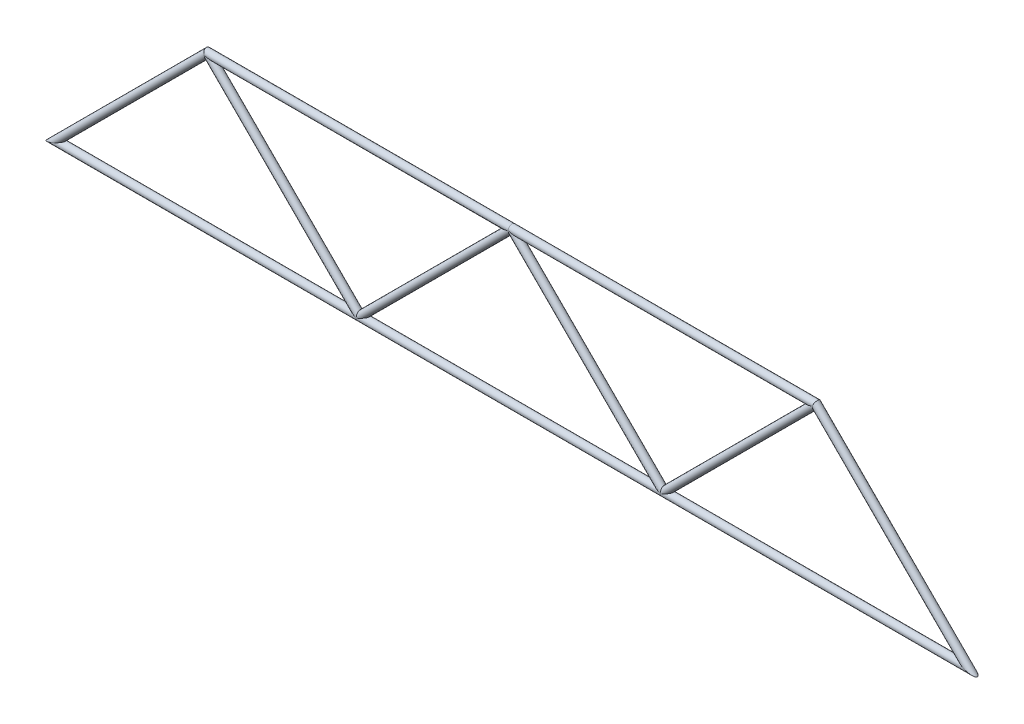
ISO-10303-21;
HEADER;
FILE_DESCRIPTION(('STEP AP214'),'2;1');
FILE_NAME('part.step','',(''),(''),'','','');
FILE_SCHEMA(('AUTOMOTIVE_DESIGN { 1 0 10303 214 1 1 1 1 }'));
ENDSEC;
DATA;
#1=APPLICATION_CONTEXT('core data for automotive mechanical design processes');
#2=APPLICATION_PROTOCOL_DEFINITION('international standard','automotive_design',2000,#1);
#3=PRODUCT_CONTEXT('',#1,'mechanical');
#4=PRODUCT('Part','Part','',(#3));
#5=PRODUCT_RELATED_PRODUCT_CATEGORY('part','',(#4));
#6=PRODUCT_DEFINITION_FORMATION('','',#4);
#7=PRODUCT_DEFINITION_CONTEXT('part definition',#1,'design');
#8=PRODUCT_DEFINITION('design','',#6,#7);
#9=PRODUCT_DEFINITION_SHAPE('','',#8);
#10=(LENGTH_UNIT() NAMED_UNIT(*) SI_UNIT(.MILLI.,.METRE.));
#11=(NAMED_UNIT(*) PLANE_ANGLE_UNIT() SI_UNIT($,.RADIAN.));
#12=(NAMED_UNIT(*) SI_UNIT($,.STERADIAN.) SOLID_ANGLE_UNIT());
#13=UNCERTAINTY_MEASURE_WITH_UNIT(LENGTH_MEASURE(1.E-05),#10,'distance_accuracy_value','');
#14=(GEOMETRIC_REPRESENTATION_CONTEXT(3) GLOBAL_UNCERTAINTY_ASSIGNED_CONTEXT((#13)) GLOBAL_UNIT_ASSIGNED_CONTEXT((#10,
#11,#12)) REPRESENTATION_CONTEXT('',''));
#15=CARTESIAN_POINT('',(0.,0.,0.));
#16=DIRECTION('',(0.,0.,1.));
#17=DIRECTION('',(1.,0.,0.));
#18=AXIS2_PLACEMENT_3D('',#15,#16,#17);
#19=CARTESIAN_POINT('',(999.999999999996,1000.,0.));
#20=DIRECTION('',(-0.707106781186546,-0.707106781186549,0.));
#21=DIRECTION('',(0.707106781186549,-0.707106781186546,0.));
#22=AXIS2_PLACEMENT_3D('',#19,#20,#21);
#23=CYLINDRICAL_SURFACE('',#22,25.);
#24=CARTESIAN_POINT('',(999.999999999996,1000.,0.));
#25=DIRECTION('',(0.923879532511286,0.38268343236509,0.));
#26=DIRECTION('',(0.382683432365091,-0.923879532511286,0.));
#27=AXIS2_PLACEMENT_3D('',#24,#25,#26);
#28=ELLIPSE('',#27,27.0598050073099,25.);
#29=CARTESIAN_POINT('',(1010.35533905932,975.,0.));
#30=VERTEX_POINT('',#29);
#31=EDGE_CURVE('E66',#30,#30,#28,.T.);
#32=ORIENTED_EDGE('',*,*,#31,.F.);
#33=EDGE_LOOP('',(#32));
#34=FACE_BOUND('',#33,.T.);
#35=CARTESIAN_POINT('',(1.66533453693773E-13,1.66533453693773E-13,0.));
#36=DIRECTION('',(0.382683432365091,-0.923879532511286,0.));
#37=DIRECTION('',(-0.923879532511286,-0.382683432365091,0.));
#38=AXIS2_PLACEMENT_3D('',#35,#36,#37);
#39=ELLIPSE('',#38,65.3281482438187,25.);
#40=CARTESIAN_POINT('',(-60.3553390593271,-24.9999999999999,0.));
#41=VERTEX_POINT('',#40);
#42=EDGE_CURVE('E12',#41,#41,#39,.T.);
#43=ORIENTED_EDGE('',*,*,#42,.F.);
#44=EDGE_LOOP('',(#43));
#45=FACE_BOUND('',#44,.T.);
#46=ADVANCED_FACE('F59',(#34,#45),#23,.T.);
#47=CARTESIAN_POINT('',(999.999999999996,1000.,0.));
#48=DIRECTION('',(0.923879532511286,0.38268343236509,0.));
#49=DIRECTION('',(-0.382683432365091,0.923879532511286,0.));
#50=AXIS2_PLACEMENT_3D('',#47,#48,#49);
#51=PLANE('',#50);
#52=ORIENTED_EDGE('',*,*,#31,.T.);
#53=EDGE_LOOP('',(#52));
#54=FACE_BOUND('',#53,.T.);
#55=ADVANCED_FACE('F72',(#54),#51,.T.);
#56=CARTESIAN_POINT('',(1.66533453693773E-13,1.66533453693773E-13,0.));
#57=DIRECTION('',(0.382683432365091,-0.923879532511286,0.));
#58=DIRECTION('',(0.923879532511286,0.382683432365091,0.));
#59=AXIS2_PLACEMENT_3D('',#56,#57,#58);
#60=PLANE('',#59);
#61=ORIENTED_EDGE('',*,*,#42,.T.);
#62=EDGE_LOOP('',(#61));
#63=FACE_BOUND('',#62,.T.);
#64=ADVANCED_FACE('F61',(#63),#60,.T.);
#65=CLOSED_SHELL('',(#46,#55,#64));
#66=MANIFOLD_SOLID_BREP('B2',#65);
#67=CARTESIAN_POINT('',(-9.99200722162641E-13,1.77635683940025E-12,0.));
#68=DIRECTION('',(1.,0.,0.));
#69=DIRECTION('',(0.,0.,-1.));
#70=AXIS2_PLACEMENT_3D('',#67,#68,#69);
#71=CYLINDRICAL_SURFACE('',#70,25.);
#72=CARTESIAN_POINT('',(2000.,1.77643815456319E-12,0.));
#73=DIRECTION('',(1.,0.,0.));
#74=DIRECTION('',(0.,1.,0.));
#75=AXIS2_PLACEMENT_3D('',#72,#73,#74);
#76=CIRCLE('',#75,25.);
#77=CARTESIAN_POINT('',(2000.,25.0000000000018,0.));
#78=VERTEX_POINT('',#77);
#79=EDGE_CURVE('E150',#78,#78,#76,.T.);
#80=ORIENTED_EDGE('',*,*,#79,.F.);
#81=EDGE_LOOP('',(#80));
#82=FACE_BOUND('',#81,.T.);
#83=CARTESIAN_POINT('',(4.21884749357559E-12,1.776248419183E-12,0.));
#84=DIRECTION('',(-0.382683432365091,0.923879532511287,0.));
#85=DIRECTION('',(0.923879532511286,0.382683432365091,0.));
#86=AXIS2_PLACEMENT_3D('',#83,#84,#85);
#87=ELLIPSE('',#86,65.3281482438187,25.);
#88=CARTESIAN_POINT('',(60.3553390593314,25.0000000000018,0.));
#89=VERTEX_POINT('',#88);
#90=EDGE_CURVE('E58',#89,#89,#87,.T.);
#91=ORIENTED_EDGE('',*,*,#90,.F.);
#92=EDGE_LOOP('',(#91));
#93=FACE_BOUND('',#92,.T.);
#94=ADVANCED_FACE('F143',(#82,#93),#71,.T.);
#95=CARTESIAN_POINT('',(2000.,0.,0.));
#96=DIRECTION('',(1.,0.,0.));
#97=DIRECTION('',(0.,1.,0.));
#98=AXIS2_PLACEMENT_3D('',#95,#96,#97);
#99=PLANE('',#98);
#100=ORIENTED_EDGE('',*,*,#79,.T.);
#101=EDGE_LOOP('',(#100));
#102=FACE_BOUND('',#101,.T.);
#103=ADVANCED_FACE('F156',(#102),#99,.T.);
#104=CARTESIAN_POINT('',(-1.11022302462516E-13,0.,0.));
#105=DIRECTION('',(-0.382683432365091,0.923879532511287,0.));
#106=DIRECTION('',(-0.923879532511286,-0.382683432365091,0.));
#107=AXIS2_PLACEMENT_3D('',#104,#105,#106);
#108=PLANE('',#107);
#109=ORIENTED_EDGE('',*,*,#90,.T.);
#110=EDGE_LOOP('',(#109));
#111=FACE_BOUND('',#110,.T.);
#112=ADVANCED_FACE('F145',(#111),#108,.T.);
#113=CLOSED_SHELL('',(#94,#103,#112));
#114=MANIFOLD_SOLID_BREP('B7',#113);
#115=CARTESIAN_POINT('',(2000.,-1.66533453693773E-13,0.));
#116=DIRECTION('',(-0.707106781186549,0.707106781186546,0.));
#117=DIRECTION('',(-0.707106781186546,-0.707106781186549,0.));
#118=AXIS2_PLACEMENT_3D('',#115,#116,#117);
#119=CYLINDRICAL_SURFACE('',#118,25.);
#120=CARTESIAN_POINT('',(2000.,1.72084568816899E-12,0.));
#121=DIRECTION('',(0.382683432365089,0.923879532511287,0.));
#122=DIRECTION('',(-0.923879532511287,0.382683432365089,0.));
#123=AXIS2_PLACEMENT_3D('',#120,#121,#122);
#124=ELLIPSE('',#123,65.328148243819,25.);
#125=CARTESIAN_POINT('',(2000.,3.38618022510673E-12,25.));
#126=VERTEX_POINT('',#125);
#127=CARTESIAN_POINT('',(2000.,3.38618022510673E-12,-25.));
#128=VERTEX_POINT('',#127);
#129=EDGE_CURVE('E250',#126,#128,#124,.F.);
#130=ORIENTED_EDGE('',*,*,#129,.F.);
#131=CARTESIAN_POINT('',(2000.,-1.66533453693773E-13,0.));
#132=DIRECTION('',(1.,0.,0.));
#133=DIRECTION('',(0.,1.,0.));
#134=AXIS2_PLACEMENT_3D('',#131,#132,#133);
#135=ELLIPSE('',#134,35.3553390593274,25.);
#136=EDGE_CURVE('E258',#128,#126,#135,.T.);
#137=ORIENTED_EDGE('',*,*,#136,.F.);
#138=EDGE_LOOP('',(#130,#137));
#139=FACE_BOUND('',#138,.T.);
#140=CARTESIAN_POINT('',(999.999999999997,1000.,0.));
#141=DIRECTION('',(0.382683432365089,0.923879532511287,0.));
#142=DIRECTION('',(-0.923879532511287,0.382683432365089,0.));
#143=AXIS2_PLACEMENT_3D('',#140,#141,#142);
#144=ELLIPSE('',#143,65.328148243819,25.);
#145=CARTESIAN_POINT('',(999.999999999996,1000.,25.));
#146=VERTEX_POINT('',#145);
#147=CARTESIAN_POINT('',(999.999999999996,1000.,-25.));
#148=VERTEX_POINT('',#147);
#149=EDGE_CURVE('E255',#146,#148,#144,.T.);
#150=ORIENTED_EDGE('',*,*,#149,.F.);
#151=CARTESIAN_POINT('',(999.999999999996,1000.,0.));
#152=DIRECTION('',(-1.,0.,0.));
#153=DIRECTION('',(0.,1.,0.));
#154=AXIS2_PLACEMENT_3D('',#151,#152,#153);
#155=ELLIPSE('',#154,35.3553390593274,25.);
#156=EDGE_CURVE('E141',#148,#146,#155,.T.);
#157=ORIENTED_EDGE('',*,*,#156,.F.);
#158=EDGE_LOOP('',(#150,#157));
#159=FACE_BOUND('',#158,.T.);
#160=ADVANCED_FACE('F225',(#139,#159),#119,.T.);
#161=CARTESIAN_POINT('',(2000.,-1.66533453693773E-13,0.));
#162=DIRECTION('',(1.,0.,0.));
#163=DIRECTION('',(0.,1.,0.));
#164=AXIS2_PLACEMENT_3D('',#161,#162,#163);
#165=PLANE('',#164);
#166=ORIENTED_EDGE('',*,*,#136,.T.);
#167=CARTESIAN_POINT('',(2000.,1.66533453693773E-12,0.));
#168=DIRECTION('',(1.,0.,0.));
#169=DIRECTION('',(0.,1.,0.));
#170=AXIS2_PLACEMENT_3D('',#167,#168,#169);
#171=CIRCLE('',#170,25.);
#172=EDGE_CURVE('E248',#126,#128,#171,.F.);
#173=ORIENTED_EDGE('',*,*,#172,.T.);
#174=EDGE_LOOP('',(#166,#173));
#175=FACE_BOUND('',#174,.T.);
#176=ADVANCED_FACE('F257',(#175),#165,.T.);
#177=CARTESIAN_POINT('',(-1.33226762955019E-12,1.99840144432528E-12,0.));
#178=DIRECTION('',(1.,0.,0.));
#179=DIRECTION('',(0.,0.,-1.));
#180=AXIS2_PLACEMENT_3D('',#177,#178,#179);
#181=CYLINDRICAL_SURFACE('',#180,25.);
#182=ORIENTED_EDGE('',*,*,#129,.T.);
#183=ORIENTED_EDGE('',*,*,#172,.F.);
#184=EDGE_LOOP('',(#182,#183));
#185=FACE_BOUND('',#184,.T.);
#186=ADVANCED_FACE('F251',(#185),#181,.F.);
#187=CARTESIAN_POINT('',(3000.,1000.,0.));
#188=DIRECTION('',(-1.,0.,0.));
#189=DIRECTION('',(0.,-1.,0.));
#190=AXIS2_PLACEMENT_3D('',#187,#188,#189);
#191=CYLINDRICAL_SURFACE('',#190,25.);
#192=ORIENTED_EDGE('',*,*,#149,.T.);
#193=CARTESIAN_POINT('',(999.999999999996,1000.,0.));
#194=DIRECTION('',(-0.923879532511286,-0.382683432365091,0.));
#195=DIRECTION('',(-0.382683432365091,0.923879532511287,0.));
#196=AXIS2_PLACEMENT_3D('',#193,#194,#195);
#197=ELLIPSE('',#196,27.0598050073099,25.);
#198=EDGE_CURVE('E229',#148,#146,#197,.T.);
#199=ORIENTED_EDGE('',*,*,#198,.T.);
#200=EDGE_LOOP('',(#192,#199));
#201=FACE_BOUND('',#200,.T.);
#202=ADVANCED_FACE('F227',(#201),#191,.F.);
#203=CARTESIAN_POINT('',(999.999999999996,1000.,0.));
#204=DIRECTION('',(-0.707106781186546,-0.707106781186549,0.));
#205=DIRECTION('',(0.707106781186549,-0.707106781186546,0.));
#206=AXIS2_PLACEMENT_3D('',#203,#204,#205);
#207=CYLINDRICAL_SURFACE('',#206,25.);
#208=ORIENTED_EDGE('',*,*,#156,.T.);
#209=ORIENTED_EDGE('',*,*,#198,.F.);
#210=EDGE_LOOP('',(#208,#209));
#211=FACE_BOUND('',#210,.T.);
#212=ADVANCED_FACE('F266',(#211),#207,.F.);
#213=CLOSED_SHELL('',(#160,#176,#186,#202,#212));
#214=MANIFOLD_SOLID_BREP('B53',#213);
#215=CARTESIAN_POINT('',(3000.,1000.00000000001,-9.87544571080938E-12));
#216=DIRECTION('',(-1.,0.,0.));
#217=DIRECTION('',(0.,-1.,0.));
#218=AXIS2_PLACEMENT_3D('',#215,#216,#217);
#219=CYLINDRICAL_SURFACE('',#218,25.);
#220=CARTESIAN_POINT('',(3000.,1000.00000000001,-9.87544571080938E-12));
#221=DIRECTION('',(1.,0.,0.));
#222=DIRECTION('',(0.,1.,0.));
#223=AXIS2_PLACEMENT_3D('',#220,#221,#222);
#224=CIRCLE('',#223,25.);
#225=CARTESIAN_POINT('',(3000.,1025.00000000001,-9.87822126837094E-12));
#226=VERTEX_POINT('',#225);
#227=EDGE_CURVE('E370',#226,#226,#224,.T.);
#228=ORIENTED_EDGE('',*,*,#227,.F.);
#229=EDGE_LOOP('',(#228));
#230=FACE_BOUND('',#229,.T.);
#231=CARTESIAN_POINT('',(999.999999999996,999.99999999999,9.87540427898686E-12));
#232=DIRECTION('',(-0.923879532511283,-0.3826834323651,0.));
#233=DIRECTION('',(-0.3826834323651,0.923879532511283,0.));
#234=AXIS2_PLACEMENT_3D('',#231,#232,#233);
#235=ELLIPSE('',#234,27.0598050073099,25.);
#236=CARTESIAN_POINT('',(989.644660940668,1024.99999999999,9.97604638116615E-12));
#237=VERTEX_POINT('',#236);
#238=EDGE_CURVE('E224',#237,#237,#235,.T.);
#239=ORIENTED_EDGE('',*,*,#238,.F.);
#240=EDGE_LOOP('',(#239));
#241=FACE_BOUND('',#240,.T.);
#242=ADVANCED_FACE('F363',(#230,#241),#219,.T.);
#243=CARTESIAN_POINT('',(3000.,1000.00000000001,-9.87544571080938E-12));
#244=DIRECTION('',(1.,0.,0.));
#245=DIRECTION('',(0.,1.,0.));
#246=AXIS2_PLACEMENT_3D('',#243,#244,#245);
#247=PLANE('',#246);
#248=ORIENTED_EDGE('',*,*,#227,.T.);
#249=EDGE_LOOP('',(#248));
#250=FACE_BOUND('',#249,.T.);
#251=ADVANCED_FACE('F376',(#250),#247,.T.);
#252=CARTESIAN_POINT('',(999.999999999996,999.99999999999,9.87540427898686E-12));
#253=DIRECTION('',(-0.923879532511283,-0.3826834323651,0.));
#254=DIRECTION('',(0.3826834323651,-0.923879532511283,0.));
#255=AXIS2_PLACEMENT_3D('',#252,#253,#254);
#256=PLANE('',#255);
#257=ORIENTED_EDGE('',*,*,#238,.T.);
#258=EDGE_LOOP('',(#257));
#259=FACE_BOUND('',#258,.T.);
#260=ADVANCED_FACE('F365',(#259),#256,.T.);
#261=CLOSED_SHELL('',(#242,#251,#260));
#262=MANIFOLD_SOLID_BREP('B135',#261);
#263=CARTESIAN_POINT('',(3000.,1000.,0.));
#264=DIRECTION('',(-0.707106781186546,-0.707106781186549,0.));
#265=DIRECTION('',(0.707106781186549,-0.707106781186546,0.));
#266=AXIS2_PLACEMENT_3D('',#263,#264,#265);
#267=CYLINDRICAL_SURFACE('',#266,25.);
#268=CARTESIAN_POINT('',(2000.,1.83186799063151E-12,0.));
#269=DIRECTION('',(0.382683432365091,-0.923879532511286,0.));
#270=DIRECTION('',(-0.923879532511286,-0.382683432365091,0.));
#271=AXIS2_PLACEMENT_3D('',#268,#269,#270);
#272=ELLIPSE('',#271,65.3281482438187,25.);
#273=CARTESIAN_POINT('',(2000.,3.38618022510673E-12,-25.));
#274=VERTEX_POINT('',#273);
#275=CARTESIAN_POINT('',(2000.,3.44169137633799E-12,25.));
#276=VERTEX_POINT('',#275);
#277=EDGE_CURVE('E457',#274,#276,#272,.T.);
#278=ORIENTED_EDGE('',*,*,#277,.F.);
#279=CARTESIAN_POINT('',(2000.,3.33066907387547E-13,0.));
#280=DIRECTION('',(-1.,0.,0.));
#281=DIRECTION('',(0.,-1.,0.));
#282=AXIS2_PLACEMENT_3D('',#279,#280,#281);
#283=ELLIPSE('',#282,35.3553390593274,25.);
#284=EDGE_CURVE('E479',#276,#274,#283,.T.);
#285=ORIENTED_EDGE('',*,*,#284,.F.);
#286=EDGE_LOOP('',(#278,#285));
#287=FACE_BOUND('',#286,.T.);
#288=CARTESIAN_POINT('',(3000.,1000.,0.));
#289=DIRECTION('',(0.382683432365091,-0.923879532511286,0.));
#290=DIRECTION('',(-0.923879532511286,-0.38268343236509,0.));
#291=AXIS2_PLACEMENT_3D('',#288,#289,#290);
#292=ELLIPSE('',#291,65.3281482438187,25.);
#293=CARTESIAN_POINT('',(3000.,1000.,-25.));
#294=VERTEX_POINT('',#293);
#295=CARTESIAN_POINT('',(3000.,1000.,25.));
#296=VERTEX_POINT('',#295);
#297=EDGE_CURVE('E361',#294,#296,#292,.F.);
#298=ORIENTED_EDGE('',*,*,#297,.F.);
#299=CARTESIAN_POINT('',(3000.,1000.,0.));
#300=DIRECTION('',(1.,0.,0.));
#301=DIRECTION('',(0.,-1.,0.));
#302=AXIS2_PLACEMENT_3D('',#299,#300,#301);
#303=ELLIPSE('',#302,35.3553390593274,25.);
#304=EDGE_CURVE('E451',#296,#294,#303,.T.);
#305=ORIENTED_EDGE('',*,*,#304,.F.);
#306=EDGE_LOOP('',(#298,#305));
#307=FACE_BOUND('',#306,.T.);
#308=ADVANCED_FACE('F447',(#287,#307),#267,.T.);
#309=CARTESIAN_POINT('',(3000.,1000.,0.));
#310=DIRECTION('',(1.,0.,0.));
#311=DIRECTION('',(0.,1.,0.));
#312=AXIS2_PLACEMENT_3D('',#309,#310,#311);
#313=PLANE('',#312);
#314=ORIENTED_EDGE('',*,*,#304,.T.);
#315=CARTESIAN_POINT('',(3000.,1000.,0.));
#316=DIRECTION('',(1.,0.,0.));
#317=DIRECTION('',(0.,1.,0.));
#318=AXIS2_PLACEMENT_3D('',#315,#316,#317);
#319=CIRCLE('',#318,25.);
#320=EDGE_CURVE('E464',#294,#296,#319,.F.);
#321=ORIENTED_EDGE('',*,*,#320,.T.);
#322=EDGE_LOOP('',(#314,#321));
#323=FACE_BOUND('',#322,.T.);
#324=ADVANCED_FACE('F488',(#323),#313,.T.);
#325=CARTESIAN_POINT('',(2000.,1.11022302462516E-13,0.));
#326=DIRECTION('',(-1.,0.,0.));
#327=DIRECTION('',(0.,-1.,0.));
#328=AXIS2_PLACEMENT_3D('',#325,#326,#327);
#329=PLANE('',#328);
#330=ORIENTED_EDGE('',*,*,#284,.T.);
#331=CARTESIAN_POINT('',(2000.,1.83186799063151E-12,0.));
#332=DIRECTION('',(-1.,0.,0.));
#333=DIRECTION('',(0.,-1.,0.));
#334=AXIS2_PLACEMENT_3D('',#331,#332,#333);
#335=CIRCLE('',#334,25.);
#336=EDGE_CURVE('E472',#274,#276,#335,.F.);
#337=ORIENTED_EDGE('',*,*,#336,.T.);
#338=EDGE_LOOP('',(#330,#337));
#339=FACE_BOUND('',#338,.T.);
#340=ADVANCED_FACE('F483',(#339),#329,.T.);
#341=CARTESIAN_POINT('',(-8.88178419700125E-13,2.22044604925031E-12,0.));
#342=DIRECTION('',(1.,0.,0.));
#343=DIRECTION('',(0.,0.,-1.));
#344=AXIS2_PLACEMENT_3D('',#341,#342,#343);
#345=CYLINDRICAL_SURFACE('',#344,25.);
#346=ORIENTED_EDGE('',*,*,#277,.T.);
#347=ORIENTED_EDGE('',*,*,#336,.F.);
#348=EDGE_LOOP('',(#346,#347));
#349=FACE_BOUND('',#348,.T.);
#350=ADVANCED_FACE('F476',(#349),#345,.F.);
#351=CARTESIAN_POINT('',(5000.,1000.,0.));
#352=DIRECTION('',(-1.,0.,0.));
#353=DIRECTION('',(0.,-1.,0.));
#354=AXIS2_PLACEMENT_3D('',#351,#352,#353);
#355=CYLINDRICAL_SURFACE('',#354,25.);
#356=ORIENTED_EDGE('',*,*,#297,.T.);
#357=ORIENTED_EDGE('',*,*,#320,.F.);
#358=EDGE_LOOP('',(#356,#357));
#359=FACE_BOUND('',#358,.T.);
#360=ADVANCED_FACE('F449',(#359),#355,.F.);
#361=CLOSED_SHELL('',(#308,#324,#340,#350,#360));
#362=MANIFOLD_SOLID_BREP('B219',#361);
#363=CARTESIAN_POINT('',(4000.,-3.33066907387547E-13,0.));
#364=DIRECTION('',(-0.707106781186549,0.707106781186546,0.));
#365=DIRECTION('',(-0.707106781186546,-0.707106781186549,0.));
#366=AXIS2_PLACEMENT_3D('',#363,#364,#365);
#367=CYLINDRICAL_SURFACE('',#366,25.);
#368=CARTESIAN_POINT('',(4000.,1.55431223447522E-12,0.));
#369=DIRECTION('',(0.382683432365089,0.923879532511287,0.));
#370=DIRECTION('',(-0.923879532511287,0.382683432365089,0.));
#371=AXIS2_PLACEMENT_3D('',#368,#369,#370);
#372=ELLIPSE('',#371,65.328148243819,25.);
#373=CARTESIAN_POINT('',(4000.,3.66373598126302E-12,25.));
#374=VERTEX_POINT('',#373);
#375=CARTESIAN_POINT('',(4000.,3.66373598126302E-12,-25.));
#376=VERTEX_POINT('',#375);
#377=EDGE_CURVE('E607',#374,#376,#372,.F.);
#378=ORIENTED_EDGE('',*,*,#377,.F.);
#379=CARTESIAN_POINT('',(4000.,-3.33066907387547E-13,0.));
#380=DIRECTION('',(1.,0.,0.));
#381=DIRECTION('',(0.,1.,0.));
#382=AXIS2_PLACEMENT_3D('',#379,#380,#381);
#383=ELLIPSE('',#382,35.3553390593274,25.);
#384=EDGE_CURVE('E617',#376,#374,#383,.T.);
#385=ORIENTED_EDGE('',*,*,#384,.F.);
#386=EDGE_LOOP('',(#378,#385));
#387=FACE_BOUND('',#386,.T.);
#388=CARTESIAN_POINT('',(3000.,1000.,0.));
#389=DIRECTION('',(0.382683432365089,0.923879532511287,0.));
#390=DIRECTION('',(-0.923879532511287,0.382683432365089,0.));
#391=AXIS2_PLACEMENT_3D('',#388,#389,#390);
#392=ELLIPSE('',#391,65.328148243819,25.);
#393=CARTESIAN_POINT('',(3000.,1000.,25.));
#394=VERTEX_POINT('',#393);
#395=CARTESIAN_POINT('',(3000.,1000.,-25.));
#396=VERTEX_POINT('',#395);
#397=EDGE_CURVE('E445',#394,#396,#392,.T.);
#398=ORIENTED_EDGE('',*,*,#397,.F.);
#399=CARTESIAN_POINT('',(3000.,1000.,0.));
#400=DIRECTION('',(-1.,0.,0.));
#401=DIRECTION('',(0.,1.,0.));
#402=AXIS2_PLACEMENT_3D('',#399,#400,#401);
#403=ELLIPSE('',#402,35.3553390593274,25.);
#404=EDGE_CURVE('E587',#396,#394,#403,.T.);
#405=ORIENTED_EDGE('',*,*,#404,.F.);
#406=EDGE_LOOP('',(#398,#405));
#407=FACE_BOUND('',#406,.T.);
#408=ADVANCED_FACE('F583',(#387,#407),#367,.T.);
#409=CARTESIAN_POINT('',(4000.,-1.11022302462516E-13,0.));
#410=DIRECTION('',(1.,0.,0.));
#411=DIRECTION('',(0.,1.,0.));
#412=AXIS2_PLACEMENT_3D('',#409,#410,#411);
#413=PLANE('',#412);
#414=ORIENTED_EDGE('',*,*,#384,.T.);
#415=CARTESIAN_POINT('',(4000.,1.66533453693773E-12,0.));
#416=DIRECTION('',(1.,0.,0.));
#417=DIRECTION('',(0.,1.,0.));
#418=AXIS2_PLACEMENT_3D('',#415,#416,#417);
#419=CIRCLE('',#418,25.);
#420=EDGE_CURVE('E610',#374,#376,#419,.F.);
#421=ORIENTED_EDGE('',*,*,#420,.T.);
#422=EDGE_LOOP('',(#414,#421));
#423=FACE_BOUND('',#422,.T.);
#424=ADVANCED_FACE('F616',(#423),#413,.T.);
#425=CARTESIAN_POINT('',(2000.,2.1094237467878E-12,0.));
#426=DIRECTION('',(1.,0.,0.));
#427=DIRECTION('',(0.,0.,-1.));
#428=AXIS2_PLACEMENT_3D('',#425,#426,#427);
#429=CYLINDRICAL_SURFACE('',#428,25.);
#430=ORIENTED_EDGE('',*,*,#377,.T.);
#431=ORIENTED_EDGE('',*,*,#420,.F.);
#432=EDGE_LOOP('',(#430,#431));
#433=FACE_BOUND('',#432,.T.);
#434=ADVANCED_FACE('F609',(#433),#429,.F.);
#435=CARTESIAN_POINT('',(3000.,1000.,0.));
#436=DIRECTION('',(-1.,0.,0.));
#437=DIRECTION('',(0.,-1.,0.));
#438=AXIS2_PLACEMENT_3D('',#435,#436,#437);
#439=PLANE('',#438);
#440=ORIENTED_EDGE('',*,*,#404,.T.);
#441=CARTESIAN_POINT('',(3000.,1000.,0.));
#442=DIRECTION('',(-1.,0.,0.));
#443=DIRECTION('',(0.,-1.,0.));
#444=AXIS2_PLACEMENT_3D('',#441,#442,#443);
#445=CIRCLE('',#444,25.);
#446=EDGE_CURVE('E592',#394,#396,#445,.F.);
#447=ORIENTED_EDGE('',*,*,#446,.T.);
#448=EDGE_LOOP('',(#440,#447));
#449=FACE_BOUND('',#448,.T.);
#450=ADVANCED_FACE('F624',(#449),#439,.T.);
#451=CARTESIAN_POINT('',(5000.,1000.,0.));
#452=DIRECTION('',(-1.,0.,0.));
#453=DIRECTION('',(0.,-1.,0.));
#454=AXIS2_PLACEMENT_3D('',#451,#452,#453);
#455=CYLINDRICAL_SURFACE('',#454,25.);
#456=ORIENTED_EDGE('',*,*,#397,.T.);
#457=ORIENTED_EDGE('',*,*,#446,.F.);
#458=EDGE_LOOP('',(#456,#457));
#459=FACE_BOUND('',#458,.T.);
#460=ADVANCED_FACE('F585',(#459),#455,.F.);
#461=CLOSED_SHELL('',(#408,#424,#434,#450,#460));
#462=MANIFOLD_SOLID_BREP('B355',#461);
#463=CARTESIAN_POINT('',(5000.,1000.,0.));
#464=DIRECTION('',(-1.,0.,0.));
#465=DIRECTION('',(0.,-1.,0.));
#466=AXIS2_PLACEMENT_3D('',#463,#464,#465);
#467=CYLINDRICAL_SURFACE('',#466,25.);
#468=CARTESIAN_POINT('',(5000.,1000.,0.));
#469=DIRECTION('',(0.923879532511287,-0.382683432365089,0.));
#470=DIRECTION('',(-0.382683432365089,-0.923879532511287,0.));
#471=AXIS2_PLACEMENT_3D('',#468,#469,#470);
#472=ELLIPSE('',#471,27.0598050073098,25.);
#473=CARTESIAN_POINT('',(4989.64466094067,975.,0.));
#474=VERTEX_POINT('',#473);
#475=EDGE_CURVE('E728',#474,#474,#472,.T.);
#476=ORIENTED_EDGE('',*,*,#475,.F.);
#477=EDGE_LOOP('',(#476));
#478=FACE_BOUND('',#477,.T.);
#479=CARTESIAN_POINT('',(3000.,1000.,0.));
#480=DIRECTION('',(-1.,0.,0.));
#481=DIRECTION('',(0.,-1.,0.));
#482=AXIS2_PLACEMENT_3D('',#479,#480,#481);
#483=CIRCLE('',#482,25.);
#484=CARTESIAN_POINT('',(3000.,975.,0.));
#485=VERTEX_POINT('',#484);
#486=EDGE_CURVE('E582',#485,#485,#483,.T.);
#487=ORIENTED_EDGE('',*,*,#486,.F.);
#488=EDGE_LOOP('',(#487));
#489=FACE_BOUND('',#488,.T.);
#490=ADVANCED_FACE('F721',(#478,#489),#467,.T.);
#491=CARTESIAN_POINT('',(5000.,1000.,0.));
#492=DIRECTION('',(0.923879532511287,-0.382683432365089,0.));
#493=DIRECTION('',(0.382683432365089,0.923879532511287,0.));
#494=AXIS2_PLACEMENT_3D('',#491,#492,#493);
#495=PLANE('',#494);
#496=ORIENTED_EDGE('',*,*,#475,.T.);
#497=EDGE_LOOP('',(#496));
#498=FACE_BOUND('',#497,.T.);
#499=ADVANCED_FACE('F734',(#498),#495,.T.);
#500=CARTESIAN_POINT('',(3000.,1000.,0.));
#501=DIRECTION('',(-1.,0.,0.));
#502=DIRECTION('',(0.,-1.,0.));
#503=AXIS2_PLACEMENT_3D('',#500,#501,#502);
#504=PLANE('',#503);
#505=ORIENTED_EDGE('',*,*,#486,.T.);
#506=EDGE_LOOP('',(#505));
#507=FACE_BOUND('',#506,.T.);
#508=ADVANCED_FACE('F723',(#507),#504,.T.);
#509=CLOSED_SHELL('',(#490,#499,#508));
#510=MANIFOLD_SOLID_BREP('B439',#509);
#511=CARTESIAN_POINT('',(4000.,-1.11022302462516E-13,0.));
#512=DIRECTION('',(-1.,0.,0.));
#513=DIRECTION('',(0.,-1.,0.));
#514=AXIS2_PLACEMENT_3D('',#511,#512,#513);
#515=PLANE('',#514);
#516=CARTESIAN_POINT('',(4000.,1.11022302462516E-13,0.));
#517=DIRECTION('',(-1.,0.,0.));
#518=DIRECTION('',(0.,-1.,0.));
#519=AXIS2_PLACEMENT_3D('',#516,#517,#518);
#520=ELLIPSE('',#519,35.3553390593274,25.);
#521=CARTESIAN_POINT('',(4000.,3.33066907387547E-12,25.));
#522=VERTEX_POINT('',#521);
#523=CARTESIAN_POINT('',(4000.,3.33066907387547E-12,-25.));
#524=VERTEX_POINT('',#523);
#525=EDGE_CURVE('E835',#522,#524,#520,.T.);
#526=ORIENTED_EDGE('',*,*,#525,.T.);
#527=CARTESIAN_POINT('',(4000.,1.72084568816899E-12,0.));
#528=DIRECTION('',(-1.,0.,0.));
#529=DIRECTION('',(0.,-1.,0.));
#530=AXIS2_PLACEMENT_3D('',#527,#528,#529);
#531=CIRCLE('',#530,25.);
#532=EDGE_CURVE('E824',#524,#522,#531,.F.);
#533=ORIENTED_EDGE('',*,*,#532,.T.);
#534=EDGE_LOOP('',(#526,#533));
#535=FACE_BOUND('',#534,.T.);
#536=ADVANCED_FACE('F803',(#535),#515,.T.);
#537=CARTESIAN_POINT('',(2000.,1.22124532708767E-12,0.));
#538=DIRECTION('',(1.,0.,0.));
#539=DIRECTION('',(0.,0.,-1.));
#540=AXIS2_PLACEMENT_3D('',#537,#538,#539);
#541=CYLINDRICAL_SURFACE('',#540,25.);
#542=CARTESIAN_POINT('',(4000.,1.55431223447522E-12,0.));
#543=DIRECTION('',(0.38268343236509,-0.923879532511286,0.));
#544=DIRECTION('',(-0.923879532511287,-0.382683432365091,0.));
#545=AXIS2_PLACEMENT_3D('',#542,#543,#544);
#546=ELLIPSE('',#545,65.3281482438187,25.);
#547=EDGE_CURVE('E832',#524,#522,#546,.T.);
#548=ORIENTED_EDGE('',*,*,#547,.T.);
#549=ORIENTED_EDGE('',*,*,#532,.F.);
#550=EDGE_LOOP('',(#548,#549));
#551=FACE_BOUND('',#550,.T.);
#552=ADVANCED_FACE('F805',(#551),#541,.F.);
#553=CARTESIAN_POINT('',(5000.,1000.,0.));
#554=DIRECTION('',(-0.707106781186546,-0.707106781186549,0.));
#555=DIRECTION('',(0.707106781186549,-0.707106781186546,0.));
#556=AXIS2_PLACEMENT_3D('',#553,#554,#555);
#557=CYLINDRICAL_SURFACE('',#556,25.);
#558=ORIENTED_EDGE('',*,*,#547,.F.);
#559=ORIENTED_EDGE('',*,*,#525,.F.);
#560=EDGE_LOOP('',(#558,#559));
#561=FACE_BOUND('',#560,.T.);
#562=CARTESIAN_POINT('',(5000.,1000.,0.));
#563=DIRECTION('',(-1.,0.,0.));
#564=DIRECTION('',(0.,-1.,0.));
#565=AXIS2_PLACEMENT_3D('',#562,#563,#564);
#566=ELLIPSE('',#565,35.3553390593274,25.);
#567=CARTESIAN_POINT('',(5000.,1000.,25.));
#568=VERTEX_POINT('',#567);
#569=CARTESIAN_POINT('',(5000.,1000.,-25.));
#570=VERTEX_POINT('',#569);
#571=EDGE_CURVE('E719',#568,#570,#566,.F.);
#572=ORIENTED_EDGE('',*,*,#571,.F.);
#573=CARTESIAN_POINT('',(5000.,1000.,0.));
#574=DIRECTION('',(0.38268343236509,-0.923879532511286,0.));
#575=DIRECTION('',(-0.923879532511287,-0.382683432365091,0.));
#576=AXIS2_PLACEMENT_3D('',#573,#574,#575);
#577=ELLIPSE('',#576,65.3281482438187,25.);
#578=EDGE_CURVE('E811',#570,#568,#577,.F.);
#579=ORIENTED_EDGE('',*,*,#578,.F.);
#580=EDGE_LOOP('',(#572,#579));
#581=FACE_BOUND('',#580,.T.);
#582=ADVANCED_FACE('F837',(#561,#581),#557,.T.);
#583=CARTESIAN_POINT('',(5000.,1000.,0.));
#584=DIRECTION('',(-1.,0.,0.));
#585=DIRECTION('',(0.,-1.,0.));
#586=AXIS2_PLACEMENT_3D('',#583,#584,#585);
#587=CYLINDRICAL_SURFACE('',#586,25.);
#588=ORIENTED_EDGE('',*,*,#578,.T.);
#589=CARTESIAN_POINT('',(5000.,999.999999999999,0.));
#590=DIRECTION('',(-0.923879532511287,0.382683432365089,0.));
#591=DIRECTION('',(0.382683432365089,0.923879532511288,0.));
#592=AXIS2_PLACEMENT_3D('',#589,#590,#591);
#593=ELLIPSE('',#592,27.0598050073099,25.);
#594=EDGE_CURVE('E817',#570,#568,#593,.T.);
#595=ORIENTED_EDGE('',*,*,#594,.F.);
#596=EDGE_LOOP('',(#588,#595));
#597=FACE_BOUND('',#596,.T.);
#598=ADVANCED_FACE('F829',(#597),#587,.F.);
#599=CARTESIAN_POINT('',(6000.,0.,0.));
#600=DIRECTION('',(-0.707106781186549,0.707106781186546,0.));
#601=DIRECTION('',(-0.707106781186546,-0.707106781186549,0.));
#602=AXIS2_PLACEMENT_3D('',#599,#600,#601);
#603=CYLINDRICAL_SURFACE('',#602,25.);
#604=ORIENTED_EDGE('',*,*,#571,.T.);
#605=ORIENTED_EDGE('',*,*,#594,.T.);
#606=EDGE_LOOP('',(#604,#605));
#607=FACE_BOUND('',#606,.T.);
#608=ADVANCED_FACE('F834',(#607),#603,.F.);
#609=CLOSED_SHELL('',(#536,#552,#582,#598,#608));
#610=MANIFOLD_SOLID_BREP('B577',#609);
#611=CARTESIAN_POINT('',(6000.,-1.66533453693773E-13,0.));
#612=DIRECTION('',(-0.707106781186549,0.707106781186546,0.));
#613=DIRECTION('',(-0.707106781186546,-0.707106781186549,0.));
#614=AXIS2_PLACEMENT_3D('',#611,#612,#613);
#615=CYLINDRICAL_SURFACE('',#614,25.);
#616=CARTESIAN_POINT('',(6000.,8.32667268468867E-13,0.));
#617=DIRECTION('',(-0.382683432365089,-0.923879532511287,0.));
#618=DIRECTION('',(-0.923879532511287,0.382683432365089,0.));
#619=AXIS2_PLACEMENT_3D('',#616,#617,#618);
#620=ELLIPSE('',#619,65.3281482438189,25.);
#621=CARTESIAN_POINT('',(5939.64466094067,25.0000000000008,0.));
#622=VERTEX_POINT('',#621);
#623=EDGE_CURVE('E946',#622,#622,#620,.T.);
#624=ORIENTED_EDGE('',*,*,#623,.F.);
#625=EDGE_LOOP('',(#624));
#626=FACE_BOUND('',#625,.T.);
#627=CARTESIAN_POINT('',(5000.,999.999999999999,0.));
#628=DIRECTION('',(-0.923879532511287,0.382683432365089,0.));
#629=DIRECTION('',(0.382683432365089,0.923879532511287,0.));
#630=AXIS2_PLACEMENT_3D('',#627,#628,#629);
#631=ELLIPSE('',#630,27.0598050073099,25.);
#632=CARTESIAN_POINT('',(5010.35533905932,1025.,0.));
#633=VERTEX_POINT('',#632);
#634=EDGE_CURVE('E802',#633,#633,#631,.T.);
#635=ORIENTED_EDGE('',*,*,#634,.F.);
#636=EDGE_LOOP('',(#635));
#637=FACE_BOUND('',#636,.T.);
#638=ADVANCED_FACE('F939',(#626,#637),#615,.T.);
#639=CARTESIAN_POINT('',(6000.,0.,0.));
#640=DIRECTION('',(-0.382683432365089,-0.923879532511287,0.));
#641=DIRECTION('',(0.923879532511287,-0.382683432365089,0.));
#642=AXIS2_PLACEMENT_3D('',#639,#640,#641);
#643=PLANE('',#642);
#644=ORIENTED_EDGE('',*,*,#623,.T.);
#645=EDGE_LOOP('',(#644));
#646=FACE_BOUND('',#645,.T.);
#647=ADVANCED_FACE('F952',(#646),#643,.T.);
#648=CARTESIAN_POINT('',(5000.,1000.,0.));
#649=DIRECTION('',(-0.923879532511287,0.382683432365089,0.));
#650=DIRECTION('',(-0.382683432365089,-0.923879532511287,0.));
#651=AXIS2_PLACEMENT_3D('',#648,#649,#650);
#652=PLANE('',#651);
#653=ORIENTED_EDGE('',*,*,#634,.T.);
#654=EDGE_LOOP('',(#653));
#655=FACE_BOUND('',#654,.T.);
#656=ADVANCED_FACE('F941',(#655),#652,.T.);
#657=CLOSED_SHELL('',(#638,#647,#656));
#658=MANIFOLD_SOLID_BREP('B713',#657);
#659=CARTESIAN_POINT('',(4000.,-8.10137547324619E-12,9.87790170269228E-12));
#660=DIRECTION('',(1.,0.,0.));
#661=DIRECTION('',(0.,0.,-1.));
#662=AXIS2_PLACEMENT_3D('',#659,#660,#661);
#663=CYLINDRICAL_SURFACE('',#662,25.);
#664=CARTESIAN_POINT('',(4000.,-8.1014025783005E-12,9.87782038752934E-12));
#665=DIRECTION('',(-1.,0.,0.));
#666=DIRECTION('',(0.,-1.,0.));
#667=AXIS2_PLACEMENT_3D('',#664,#665,#666);
#668=CIRCLE('',#667,25.);
#669=CARTESIAN_POINT('',(4000.,-25.0000000000081,9.87920816631012E-12));
#670=VERTEX_POINT('',#669);
#671=EDGE_CURVE('E1028',#670,#670,#668,.T.);
#672=ORIENTED_EDGE('',*,*,#671,.F.);
#673=EDGE_LOOP('',(#672));
#674=FACE_BOUND('',#673,.T.);
#675=CARTESIAN_POINT('',(6000.,1.16494541877593E-11,-9.87341584929084E-12));
#676=DIRECTION('',(0.38268343236508,0.923879532511291,0.));
#677=DIRECTION('',(0.923879532511291,-0.38268343236508,0.));
#678=AXIS2_PLACEMENT_3D('',#675,#676,#677);
#679=ELLIPSE('',#678,65.328148243819,25.);
#680=CARTESIAN_POINT('',(6060.35533905932,-24.9999999999878,-1.04645256861326E-11));
#681=VERTEX_POINT('',#680);
#682=EDGE_CURVE('E938',#681,#681,#679,.T.);
#683=ORIENTED_EDGE('',*,*,#682,.F.);
#684=EDGE_LOOP('',(#683));
#685=FACE_BOUND('',#684,.T.);
#686=ADVANCED_FACE('F1020',(#674,#685),#663,.T.);
#687=CARTESIAN_POINT('',(4000.,-9.87781362780937E-12,9.87784749258365E-12));
#688=DIRECTION('',(-1.,0.,0.));
#689=DIRECTION('',(0.,-1.,0.));
#690=AXIS2_PLACEMENT_3D('',#687,#688,#689);
#691=PLANE('',#690);
#692=ORIENTED_EDGE('',*,*,#671,.T.);
#693=EDGE_LOOP('',(#692));
#694=FACE_BOUND('',#693,.T.);
#695=ADVANCED_FACE('F1035',(#694),#691,.T.);
#696=CARTESIAN_POINT('',(6000.,9.87320576857631E-12,-9.87330742907359E-12));
#697=DIRECTION('',(0.38268343236508,0.923879532511291,0.));
#698=DIRECTION('',(-0.923879532511291,0.38268343236508,0.));
#699=AXIS2_PLACEMENT_3D('',#696,#697,#698);
#700=PLANE('',#699);
#701=ORIENTED_EDGE('',*,*,#682,.T.);
#702=EDGE_LOOP('',(#701));
#703=FACE_BOUND('',#702,.T.);
#704=ADVANCED_FACE('F1022',(#703),#700,.T.);
#705=CLOSED_SHELL('',(#686,#695,#704));
#706=MANIFOLD_SOLID_BREP('B797',#705);
#707=CARTESIAN_POINT('',(2000.,1.77635683940025E-12,0.));
#708=DIRECTION('',(1.,0.,0.));
#709=DIRECTION('',(0.,0.,-1.));
#710=AXIS2_PLACEMENT_3D('',#707,#708,#709);
#711=CYLINDRICAL_SURFACE('',#710,25.);
#712=CARTESIAN_POINT('',(2000.,1.77635683940025E-12,0.));
#713=DIRECTION('',(-1.,0.,0.));
#714=DIRECTION('',(0.,-1.,0.));
#715=AXIS2_PLACEMENT_3D('',#712,#713,#714);
#716=CIRCLE('',#715,25.);
#717=CARTESIAN_POINT('',(2000.,-24.9999999999982,0.));
#718=VERTEX_POINT('',#717);
#719=EDGE_CURVE('E1103',#718,#718,#716,.T.);
#720=ORIENTED_EDGE('',*,*,#719,.F.);
#721=EDGE_LOOP('',(#720));
#722=FACE_BOUND('',#721,.T.);
#723=CARTESIAN_POINT('',(4000.,1.77635683940025E-12,0.));
#724=DIRECTION('',(1.,0.,0.));
#725=DIRECTION('',(0.,1.,0.));
#726=AXIS2_PLACEMENT_3D('',#723,#724,#725);
#727=CIRCLE('',#726,25.);
#728=CARTESIAN_POINT('',(4000.,25.0000000000018,0.));
#729=VERTEX_POINT('',#728);
#730=EDGE_CURVE('E1019',#729,#729,#727,.T.);
#731=ORIENTED_EDGE('',*,*,#730,.F.);
#732=EDGE_LOOP('',(#731));
#733=FACE_BOUND('',#732,.T.);
#734=ADVANCED_FACE('F1096',(#722,#733),#711,.T.);
#735=CARTESIAN_POINT('',(2000.,0.,0.));
#736=DIRECTION('',(-1.,0.,0.));
#737=DIRECTION('',(0.,-1.,0.));
#738=AXIS2_PLACEMENT_3D('',#735,#736,#737);
#739=PLANE('',#738);
#740=ORIENTED_EDGE('',*,*,#719,.T.);
#741=EDGE_LOOP('',(#740));
#742=FACE_BOUND('',#741,.T.);
#743=ADVANCED_FACE('F1109',(#742),#739,.T.);
#744=CARTESIAN_POINT('',(4000.,0.,0.));
#745=DIRECTION('',(1.,0.,0.));
#746=DIRECTION('',(0.,1.,0.));
#747=AXIS2_PLACEMENT_3D('',#744,#745,#746);
#748=PLANE('',#747);
#749=ORIENTED_EDGE('',*,*,#730,.T.);
#750=EDGE_LOOP('',(#749));
#751=FACE_BOUND('',#750,.T.);
#752=ADVANCED_FACE('F1098',(#751),#748,.T.);
#753=CLOSED_SHELL('',(#734,#743,#752));
#754=MANIFOLD_SOLID_BREP('B933',#753);
#755=ADVANCED_BREP_SHAPE_REPRESENTATION('',(#18,#66,#114,#214,#262,#362,#462,#510,#610,#658,
#706,#754),#14);
#756=SHAPE_DEFINITION_REPRESENTATION(#9,#755);
ENDSEC;
END-ISO-10303-21;
